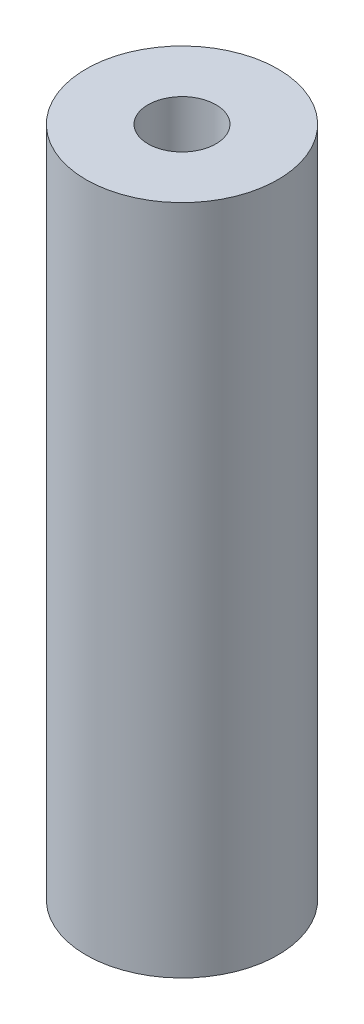
ISO-10303-21;
HEADER;
FILE_DESCRIPTION(('STEP AP214'),'2;1');
FILE_NAME('part.step','',(''),(''),'','','');
FILE_SCHEMA(('AUTOMOTIVE_DESIGN { 1 0 10303 214 1 1 1 1 }'));
ENDSEC;
DATA;
#1=APPLICATION_CONTEXT('core data for automotive mechanical design processes');
#2=APPLICATION_PROTOCOL_DEFINITION('international standard','automotive_design',2000,#1);
#3=PRODUCT_CONTEXT('',#1,'mechanical');
#4=PRODUCT('Part','Part','',(#3));
#5=PRODUCT_RELATED_PRODUCT_CATEGORY('part','',(#4));
#6=PRODUCT_DEFINITION_FORMATION('','',#4);
#7=PRODUCT_DEFINITION_CONTEXT('part definition',#1,'design');
#8=PRODUCT_DEFINITION('design','',#6,#7);
#9=PRODUCT_DEFINITION_SHAPE('','',#8);
#10=(LENGTH_UNIT() NAMED_UNIT(*) SI_UNIT(.MILLI.,.METRE.));
#11=(NAMED_UNIT(*) PLANE_ANGLE_UNIT() SI_UNIT($,.RADIAN.));
#12=(NAMED_UNIT(*) SI_UNIT($,.STERADIAN.) SOLID_ANGLE_UNIT());
#13=UNCERTAINTY_MEASURE_WITH_UNIT(LENGTH_MEASURE(1.E-05),#10,'distance_accuracy_value','');
#14=(GEOMETRIC_REPRESENTATION_CONTEXT(3) GLOBAL_UNCERTAINTY_ASSIGNED_CONTEXT((#13)) GLOBAL_UNIT_ASSIGNED_CONTEXT((#10,
#11,#12)) REPRESENTATION_CONTEXT('',''));
#15=CARTESIAN_POINT('',(0.,0.,0.));
#16=DIRECTION('',(0.,0.,1.));
#17=DIRECTION('',(1.,0.,0.));
#18=AXIS2_PLACEMENT_3D('',#15,#16,#17);
#19=CARTESIAN_POINT('',(0.,44.45,0.));
#20=DIRECTION('',(0.,-1.,0.));
#21=DIRECTION('',(0.,0.,-1.));
#22=AXIS2_PLACEMENT_3D('',#19,#20,#21);
#23=CYLINDRICAL_SURFACE('',#22,6.35);
#24=CARTESIAN_POINT('',(0.,44.45,0.));
#25=DIRECTION('',(0.,1.,0.));
#26=DIRECTION('',(0.,0.,1.));
#27=AXIS2_PLACEMENT_3D('',#24,#25,#26);
#28=CIRCLE('',#27,6.35);
#29=CARTESIAN_POINT('',(0.,44.45,6.35));
#30=VERTEX_POINT('',#29);
#31=EDGE_CURVE('E10',#30,#30,#28,.T.);
#32=ORIENTED_EDGE('',*,*,#31,.F.);
#33=EDGE_LOOP('',(#32));
#34=FACE_BOUND('',#33,.T.);
#35=CARTESIAN_POINT('',(0.,0.,0.));
#36=DIRECTION('',(0.,1.,0.));
#37=DIRECTION('',(0.,0.,1.));
#38=AXIS2_PLACEMENT_3D('',#35,#36,#37);
#39=CIRCLE('',#38,6.35);
#40=CARTESIAN_POINT('',(0.,0.,6.35));
#41=VERTEX_POINT('',#40);
#42=EDGE_CURVE('E37',#41,#41,#39,.T.);
#43=ORIENTED_EDGE('',*,*,#42,.T.);
#44=EDGE_LOOP('',(#43));
#45=FACE_BOUND('',#44,.T.);
#46=ADVANCED_FACE('F34',(#34,#45),#23,.T.);
#47=CARTESIAN_POINT('',(0.,44.45,0.));
#48=DIRECTION('',(0.,1.,0.));
#49=DIRECTION('',(0.,0.,1.));
#50=AXIS2_PLACEMENT_3D('',#47,#48,#49);
#51=PLANE('',#50);
#52=CARTESIAN_POINT('',(0.,44.45,0.));
#53=DIRECTION('',(0.,1.,0.));
#54=DIRECTION('',(0.,0.,1.));
#55=AXIS2_PLACEMENT_3D('',#52,#53,#54);
#56=CIRCLE('',#55,2.24789999999999);
#57=CARTESIAN_POINT('',(0.,44.45,2.24789999999999));
#58=VERTEX_POINT('',#57);
#59=EDGE_CURVE('E48',#58,#58,#56,.T.);
#60=ORIENTED_EDGE('',*,*,#59,.F.);
#61=EDGE_LOOP('',(#60));
#62=FACE_BOUND('',#61,.T.);
#63=ORIENTED_EDGE('',*,*,#31,.T.);
#64=EDGE_LOOP('',(#63));
#65=FACE_BOUND('',#64,.T.);
#66=ADVANCED_FACE('F54',(#62,#65),#51,.T.);
#67=CARTESIAN_POINT('',(0.,0.,0.));
#68=DIRECTION('',(0.,1.,0.));
#69=DIRECTION('',(0.,0.,1.));
#70=AXIS2_PLACEMENT_3D('',#67,#68,#69);
#71=PLANE('',#70);
#72=CARTESIAN_POINT('',(0.,0.,0.));
#73=DIRECTION('',(0.,1.,0.));
#74=DIRECTION('',(0.,0.,1.));
#75=AXIS2_PLACEMENT_3D('',#72,#73,#74);
#76=CIRCLE('',#75,2.24789999999998);
#77=CARTESIAN_POINT('',(0.,0.,2.24789999999998));
#78=VERTEX_POINT('',#77);
#79=EDGE_CURVE('E44',#78,#78,#76,.T.);
#80=ORIENTED_EDGE('',*,*,#79,.T.);
#81=EDGE_LOOP('',(#80));
#82=FACE_BOUND('',#81,.T.);
#83=ORIENTED_EDGE('',*,*,#42,.F.);
#84=EDGE_LOOP('',(#83));
#85=FACE_BOUND('',#84,.T.);
#86=ADVANCED_FACE('F56',(#82,#85),#71,.F.);
#87=CARTESIAN_POINT('',(0.,44.45,0.));
#88=DIRECTION('',(0.,1.,0.));
#89=DIRECTION('',(0.,0.,1.));
#90=AXIS2_PLACEMENT_3D('',#87,#88,#89);
#91=CYLINDRICAL_SURFACE('',#90,2.24789999999998);
#92=ORIENTED_EDGE('',*,*,#79,.F.);
#93=EDGE_LOOP('',(#92));
#94=FACE_BOUND('',#93,.T.);
#95=ORIENTED_EDGE('',*,*,#59,.T.);
#96=EDGE_LOOP('',(#95));
#97=FACE_BOUND('',#96,.T.);
#98=ADVANCED_FACE('F52',(#94,#97),#91,.F.);
#99=CLOSED_SHELL('',(#46,#66,#86,#98));
#100=MANIFOLD_SOLID_BREP('B2',#99);
#101=ADVANCED_BREP_SHAPE_REPRESENTATION('',(#18,#100),#14);
#102=SHAPE_DEFINITION_REPRESENTATION(#9,#101);
ENDSEC;
END-ISO-10303-21;
